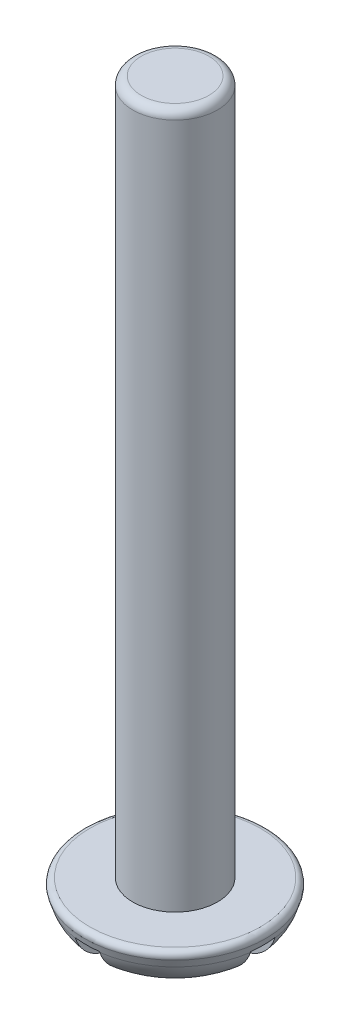
ISO-10303-21;
HEADER;
FILE_DESCRIPTION(('STEP AP214'),'2;1');
FILE_NAME('part.step','',(''),(''),'','','');
FILE_SCHEMA(('AUTOMOTIVE_DESIGN { 1 0 10303 214 1 1 1 1 }'));
ENDSEC;
DATA;
#1=APPLICATION_CONTEXT('core data for automotive mechanical design processes');
#2=APPLICATION_PROTOCOL_DEFINITION('international standard','automotive_design',2000,#1);
#3=PRODUCT_CONTEXT('',#1,'mechanical');
#4=PRODUCT('Part','Part','',(#3));
#5=PRODUCT_RELATED_PRODUCT_CATEGORY('part','',(#4));
#6=PRODUCT_DEFINITION_FORMATION('','',#4);
#7=PRODUCT_DEFINITION_CONTEXT('part definition',#1,'design');
#8=PRODUCT_DEFINITION('design','',#6,#7);
#9=PRODUCT_DEFINITION_SHAPE('','',#8);
#10=(LENGTH_UNIT() NAMED_UNIT(*) SI_UNIT(.MILLI.,.METRE.));
#11=(NAMED_UNIT(*) PLANE_ANGLE_UNIT() SI_UNIT($,.RADIAN.));
#12=(NAMED_UNIT(*) SI_UNIT($,.STERADIAN.) SOLID_ANGLE_UNIT());
#13=UNCERTAINTY_MEASURE_WITH_UNIT(LENGTH_MEASURE(1.E-05),#10,'distance_accuracy_value','');
#14=(GEOMETRIC_REPRESENTATION_CONTEXT(3) GLOBAL_UNCERTAINTY_ASSIGNED_CONTEXT((#13)) GLOBAL_UNIT_ASSIGNED_CONTEXT((#10,
#11,#12)) REPRESENTATION_CONTEXT('',''));
#15=CARTESIAN_POINT('',(0.,0.,0.));
#16=DIRECTION('',(0.,0.,1.));
#17=DIRECTION('',(1.,0.,0.));
#18=AXIS2_PLACEMENT_3D('',#15,#16,#17);
#19=CARTESIAN_POINT('',(-66.,-64.2440445445355,0.));
#20=DIRECTION('',(0.,1.,0.));
#21=DIRECTION('',(-1.,0.,0.));
#22=AXIS2_PLACEMENT_3D('',#19,#20,#21);
#23=PLANE('',#22);
#24=CARTESIAN_POINT('',(-76.,-64.24404454458,44.9));
#25=DIRECTION('',(0.,1.,0.));
#26=DIRECTION('',(0.,0.,1.));
#27=AXIS2_PLACEMENT_3D('',#24,#25,#26);
#28=CIRCLE('',#27,3.13754015185011);
#29=CARTESIAN_POINT('',(-79.1079709183227,-64.2440445445578,44.4702617361269));
#30=VERTEX_POINT('',#29);
#31=CARTESIAN_POINT('',(-79.1079709183227,-64.2440445445578,45.3297382638731));
#32=VERTEX_POINT('',#31);
#33=EDGE_CURVE('E523',#30,#32,#28,.T.);
#34=ORIENTED_EDGE('',*,*,#33,.F.);
#35=DIRECTION('',(1.,0.,0.));
#36=VECTOR('',#35,1.);
#37=CARTESIAN_POINT('',(-70.4602088971668,-64.2440445445355,44.4702617361269));
#38=LINE('',#37,#36);
#39=CARTESIAN_POINT('',(-76.429738263873,-64.2440445445355,44.4702617361269));
#40=VERTEX_POINT('',#39);
#41=EDGE_CURVE('E279',#30,#40,#38,.T.);
#42=ORIENTED_EDGE('',*,*,#41,.T.);
#43=DIRECTION('',(0.,0.,1.));
#44=VECTOR('',#43,1.);
#45=CARTESIAN_POINT('',(-76.429738263873,-64.2440445445355,50.0394058023663));
#46=LINE('',#45,#44);
#47=CARTESIAN_POINT('',(-76.429738263873,-64.2440445445578,41.7920290816773));
#48=VERTEX_POINT('',#47);
#49=EDGE_CURVE('E278',#48,#40,#46,.T.);
#50=ORIENTED_EDGE('',*,*,#49,.F.);
#51=CARTESIAN_POINT('',(-76.,-64.24404454458,44.9));
#52=DIRECTION('',(0.,1.,0.));
#53=DIRECTION('',(0.,0.,1.));
#54=AXIS2_PLACEMENT_3D('',#51,#52,#53);
#55=CIRCLE('',#54,3.13754015185011);
#56=CARTESIAN_POINT('',(-75.5702617361269,-64.2440445445578,41.7920290816773));
#57=VERTEX_POINT('',#56);
#58=EDGE_CURVE('E596',#57,#48,#55,.T.);
#59=ORIENTED_EDGE('',*,*,#58,.F.);
#60=DIRECTION('',(0.,0.,1.));
#61=VECTOR('',#60,1.);
#62=CARTESIAN_POINT('',(-75.5702617361269,-64.2440445445355,50.0394058023663));
#63=LINE('',#62,#61);
#64=CARTESIAN_POINT('',(-75.5702617361269,-64.2440445445355,44.4702617361269));
#65=VERTEX_POINT('',#64);
#66=EDGE_CURVE('E458',#57,#65,#63,.T.);
#67=ORIENTED_EDGE('',*,*,#66,.T.);
#68=DIRECTION('',(1.,0.,0.));
#69=VECTOR('',#68,1.);
#70=CARTESIAN_POINT('',(-70.4602088971668,-64.2440445445355,44.4702617361269));
#71=LINE('',#70,#69);
#72=CARTESIAN_POINT('',(-72.8920290816773,-64.2440445445578,44.4702617361269));
#73=VERTEX_POINT('',#72);
#74=EDGE_CURVE('E455',#65,#73,#71,.T.);
#75=ORIENTED_EDGE('',*,*,#74,.T.);
#76=CARTESIAN_POINT('',(-76.,-64.24404454458,44.9));
#77=DIRECTION('',(0.,1.,0.));
#78=DIRECTION('',(0.,0.,1.));
#79=AXIS2_PLACEMENT_3D('',#76,#77,#78);
#80=CIRCLE('',#79,3.13754015185011);
#81=CARTESIAN_POINT('',(-72.8920290816773,-64.2440445445578,45.3297382638731));
#82=VERTEX_POINT('',#81);
#83=EDGE_CURVE('E165',#82,#73,#80,.T.);
#84=ORIENTED_EDGE('',*,*,#83,.F.);
#85=DIRECTION('',(1.,0.,0.));
#86=VECTOR('',#85,1.);
#87=CARTESIAN_POINT('',(-70.4602088971668,-64.2440445445355,45.3297382638731));
#88=LINE('',#87,#86);
#89=CARTESIAN_POINT('',(-75.5702617361269,-64.2440445445355,45.3297382638731));
#90=VERTEX_POINT('',#89);
#91=EDGE_CURVE('E459',#90,#82,#88,.T.);
#92=ORIENTED_EDGE('',*,*,#91,.F.);
#93=DIRECTION('',(0.,0.,1.));
#94=VECTOR('',#93,1.);
#95=CARTESIAN_POINT('',(-75.5702617361269,-64.2440445445355,50.0394058023663));
#96=LINE('',#95,#94);
#97=CARTESIAN_POINT('',(-75.5702617361269,-64.2440445445578,48.0079709183227));
#98=VERTEX_POINT('',#97);
#99=EDGE_CURVE('E163',#90,#98,#96,.T.);
#100=ORIENTED_EDGE('',*,*,#99,.T.);
#101=CARTESIAN_POINT('',(-76.,-64.24404454458,44.9));
#102=DIRECTION('',(0.,1.,0.));
#103=DIRECTION('',(0.,0.,1.));
#104=AXIS2_PLACEMENT_3D('',#101,#102,#103);
#105=CIRCLE('',#104,3.13754015185011);
#106=CARTESIAN_POINT('',(-76.429738263873,-64.2440445445578,48.0079709183227));
#107=VERTEX_POINT('',#106);
#108=EDGE_CURVE('E146',#107,#98,#105,.T.);
#109=ORIENTED_EDGE('',*,*,#108,.F.);
#110=DIRECTION('',(0.,0.,1.));
#111=VECTOR('',#110,1.);
#112=CARTESIAN_POINT('',(-76.429738263873,-64.2440445445355,50.0394058023663));
#113=LINE('',#112,#111);
#114=CARTESIAN_POINT('',(-76.429738263873,-64.2440445445355,45.3297382638731));
#115=VERTEX_POINT('',#114);
#116=EDGE_CURVE('E160',#115,#107,#113,.T.);
#117=ORIENTED_EDGE('',*,*,#116,.F.);
#118=DIRECTION('',(1.,0.,0.));
#119=VECTOR('',#118,1.);
#120=CARTESIAN_POINT('',(-70.4602088971668,-64.2440445445355,45.3297382638731));
#121=LINE('',#120,#119);
#122=EDGE_CURVE('E182',#32,#115,#121,.T.);
#123=ORIENTED_EDGE('',*,*,#122,.F.);
#124=EDGE_LOOP('',(#34,#42,#50,#59,#67,#75,#84,#92,#100,#109,#117,#123));
#125=FACE_BOUND('',#124,.T.);
#126=ADVANCED_FACE('F17',(#125),#23,.F.);
#127=CARTESIAN_POINT('',(-70.4602088971668,-64.2440445445355,45.3297382638731));
#128=DIRECTION('',(0.,0.,-1.));
#129=DIRECTION('',(0.,1.,0.));
#130=AXIS2_PLACEMENT_3D('',#127,#128,#129);
#131=PLANE('',#130);
#132=DIRECTION('',(1.,0.,0.));
#133=VECTOR('',#132,1.);
#134=CARTESIAN_POINT('',(-76.,-65.2440445445355,45.3297382638731));
#135=LINE('',#134,#133);
#136=CARTESIAN_POINT('',(-77.7432741973312,-65.2440445445355,45.3297382638731));
#137=VERTEX_POINT('',#136);
#138=CARTESIAN_POINT('',(-76.429738263873,-65.2440445445355,45.3297382638731));
#139=VERTEX_POINT('',#138);
#140=EDGE_CURVE('E155',#137,#139,#135,.T.);
#141=ORIENTED_EDGE('',*,*,#140,.F.);
#142=CARTESIAN_POINT('',(-79.0972696094599,-64.2766683366526,45.3297382638731));
#143=CARTESIAN_POINT('',(-79.0850298094965,-64.3139806844564,45.3297382638731));
#144=CARTESIAN_POINT('',(-79.0712134523049,-64.3507557521747,45.3297382638731));
#145=CARTESIAN_POINT('',(-79.0405243690052,-64.4230043509682,45.3297382638731));
#146=CARTESIAN_POINT('',(-79.023651878397,-64.4584779820767,45.3297382638731));
#147=CARTESIAN_POINT('',(-78.9686557067881,-64.5624945272485,45.3297382638731));
#148=CARTESIAN_POINT('',(-78.9261102283197,-64.628763942647,45.3297382638731));
#149=CARTESIAN_POINT('',(-78.8305219251969,-64.7532117619126,45.3297382638731));
#150=CARTESIAN_POINT('',(-78.7774762648678,-64.8113879728897,45.3297382638731));
#151=CARTESIAN_POINT('',(-78.6624295741607,-64.918066795754,45.3297382638731));
#152=CARTESIAN_POINT('',(-78.6004305348628,-64.9665715527145,45.3297382638731));
#153=CARTESIAN_POINT('',(-78.468862361044,-65.0528868607357,45.3297382638731));
#154=CARTESIAN_POINT('',(-78.3992497355834,-65.0906310006582,45.3297382638731));
#155=CARTESIAN_POINT('',(-78.2547201530278,-65.1541000828846,45.3297382638731));
#156=CARTESIAN_POINT('',(-78.1798022873695,-65.1798229606943,45.3297382638731));
#157=CARTESIAN_POINT('',(-78.0444982032147,-65.2141903018014,45.3297382638731));
#158=CARTESIAN_POINT('',(-77.9847487392921,-65.2254062108368,45.3297382638731));
#159=CARTESIAN_POINT('',(-77.8644260652135,-65.2403368668095,45.3297382638731));
#160=CARTESIAN_POINT('',(-77.8038545059072,-65.2440648962274,45.3297382638731));
#161=CARTESIAN_POINT('',(-77.7432741973312,-65.2440445445355,45.3297382638731));
#162=B_SPLINE_CURVE_WITH_KNOTS('',3,(#142,#143,#144,#145,#146,#147,#148,#149,#150,#151,#152,
#153,#154,#155,#156,#157,#158,#159,#160,#161),.UNSPECIFIED.,.F.,.F.,(4,2,2,2,2,2,2,2,2,4),(0.,
0.117732729425159,0.23545639044209,0.470495711789309,0.705598594569883,0.940649274725469,
1.17712067374321,1.413632668713,1.59555904090016,1.77716241441052),.UNSPECIFIED.);
#163=CARTESIAN_POINT('',(-79.0972696094643,-64.276668336639,45.3297382638731));
#164=VERTEX_POINT('',#163);
#165=EDGE_CURVE('E271',#164,#137,#162,.T.);
#166=ORIENTED_EDGE('',*,*,#165,.F.);
#167=DIRECTION('',(-0.31168172744965,0.950186561036306,0.));
#168=VECTOR('',#167,1.);
#169=CARTESIAN_POINT('',(-79.0972696094573,-64.2766683366605,45.3297382638731));
#170=LINE('',#169,#168);
#171=EDGE_CURVE('E184',#164,#32,#170,.T.);
#172=ORIENTED_EDGE('',*,*,#171,.T.);
#173=ORIENTED_EDGE('',*,*,#122,.T.);
#174=DIRECTION('',(0.,1.,0.));
#175=VECTOR('',#174,1.);
#176=CARTESIAN_POINT('',(-76.429738263873,-64.2440445445355,45.3297382638731));
#177=LINE('',#176,#175);
#178=EDGE_CURVE('E170',#139,#115,#177,.T.);
#179=ORIENTED_EDGE('',*,*,#178,.F.);
#180=EDGE_LOOP('',(#141,#166,#172,#173,#179));
#181=FACE_BOUND('',#180,.T.);
#182=ADVANCED_FACE('F525',(#181),#131,.T.);
#183=CARTESIAN_POINT('',(-76.,-65.2440445445355,44.9));
#184=DIRECTION('',(0.,-1.,0.));
#185=DIRECTION('',(1.,0.,0.));
#186=AXIS2_PLACEMENT_3D('',#183,#184,#185);
#187=PLANE('',#186);
#188=ORIENTED_EDGE('',*,*,#140,.T.);
#189=DIRECTION('',(0.,0.,1.));
#190=VECTOR('',#189,1.);
#191=CARTESIAN_POINT('',(-76.429738263873,-65.2440445445355,50.0394058023663));
#192=LINE('',#191,#190);
#193=CARTESIAN_POINT('',(-76.4297382638727,-65.2440445445355,46.6432741973366));
#194=VERTEX_POINT('',#193);
#195=EDGE_CURVE('E154',#194,#139,#192,.F.);
#196=ORIENTED_EDGE('',*,*,#195,.F.);
#197=CARTESIAN_POINT('',(-76.,-65.2440445445355,44.9));
#198=DIRECTION('',(0.,1.,0.));
#199=DIRECTION('',(-0.970934082359855,0.,0.239347044502386));
#200=AXIS2_PLACEMENT_3D('',#197,#198,#199);
#201=CIRCLE('',#200,1.79546091645502);
#202=EDGE_CURVE('E510',#137,#194,#201,.T.);
#203=ORIENTED_EDGE('',*,*,#202,.F.);
#204=EDGE_LOOP('',(#188,#196,#203));
#205=FACE_BOUND('',#204,.T.);
#206=ADVANCED_FACE('F528',(#205),#187,.T.);
#207=CARTESIAN_POINT('',(-76.429738263873,-64.2440445445355,50.0394058023663));
#208=DIRECTION('',(1.,0.,0.));
#209=DIRECTION('',(0.,1.,0.));
#210=AXIS2_PLACEMENT_3D('',#207,#208,#209);
#211=PLANE('',#210);
#212=ORIENTED_EDGE('',*,*,#178,.T.);
#213=ORIENTED_EDGE('',*,*,#116,.T.);
#214=DIRECTION('',(0.,-0.950186561036246,-0.311681727449833));
#215=VECTOR('',#214,1.);
#216=CARTESIAN_POINT('',(-76.429738263873,-64.2440445445355,48.0079709183396));
#217=LINE('',#216,#215);
#218=CARTESIAN_POINT('',(-76.429738263873,-64.276668336639,47.9972696094643));
#219=VERTEX_POINT('',#218);
#220=EDGE_CURVE('E141',#107,#219,#217,.T.);
#221=ORIENTED_EDGE('',*,*,#220,.T.);
#222=CARTESIAN_POINT('',(-76.429738263873,-65.2440445445355,46.6432741973366));
#223=CARTESIAN_POINT('',(-76.429738263873,-65.2440517508389,46.6881301465073));
#224=CARTESIAN_POINT('',(-76.429738263873,-65.2420122114742,46.7329882302298));
#225=CARTESIAN_POINT('',(-76.429738263873,-65.2338386033226,46.8223397292429));
#226=CARTESIAN_POINT('',(-76.429738263873,-65.2277035882184,46.8668330578458));
#227=CARTESIAN_POINT('',(-76.429738263873,-65.2113435508749,46.9550350246902));
#228=CARTESIAN_POINT('',(-76.429738263873,-65.2011213125297,46.9987441759214));
#229=CARTESIAN_POINT('',(-76.429738263873,-65.176654474412,47.0850007763103));
#230=CARTESIAN_POINT('',(-76.429738263873,-65.1624106079998,47.1275484357209));
#231=CARTESIAN_POINT('',(-76.429738263873,-65.1165797597767,47.2456445128947));
#232=CARTESIAN_POINT('',(-76.429738263873,-65.0803787677518,47.3194636126137));
#233=CARTESIAN_POINT('',(-76.429738263873,-64.9958084458353,47.4596669136017));
#234=CARTESIAN_POINT('',(-76.429738263873,-64.9474469285762,47.5260558490198));
#235=CARTESIAN_POINT('',(-76.429738263873,-64.8413198326977,47.6478278381564));
#236=CARTESIAN_POINT('',(-76.429738263873,-64.7838296435142,47.7034510174641));
#237=CARTESIAN_POINT('',(-76.429738263873,-64.6602174906193,47.8040866049658));
#238=CARTESIAN_POINT('',(-76.429738263873,-64.594100374295,47.8491049323678));
#239=CARTESIAN_POINT('',(-76.429738263873,-64.4852083664648,47.9103176350549));
#240=CARTESIAN_POINT('',(-76.4297382638731,-64.4446618838941,47.9305704285894));
#241=CARTESIAN_POINT('',(-76.429738263873,-64.3618677526702,47.966998434105));
#242=CARTESIAN_POINT('',(-76.429738263873,-64.3196234370481,47.9831812220745));
#243=CARTESIAN_POINT('',(-76.4297382638729,-64.2766683366528,47.9972696094598));
#244=B_SPLINE_CURVE_WITH_KNOTS('',3,(#222,#223,#224,#225,#226,#227,#228,#229,#230,#231,#232,
#233,#234,#235,#236,#237,#238,#239,#240,#241,#242,#243),.UNSPECIFIED.,.F.,.F.,(4,2,2,2,2,2,2,2,
2,2,4),(0.,0.134523842047416,0.269078778490919,0.403542222429493,0.537981162231119,
0.78331756487569,1.02849674999703,1.26733850226045,1.50604662496479,1.64182243436018,
1.77734360560696),.UNSPECIFIED.);
#245=EDGE_CURVE('E508',#194,#219,#244,.T.);
#246=ORIENTED_EDGE('',*,*,#245,.F.);
#247=ORIENTED_EDGE('',*,*,#195,.T.);
#248=EDGE_LOOP('',(#212,#213,#221,#246,#247));
#249=FACE_BOUND('',#248,.T.);
#250=ADVANCED_FACE('F167',(#249),#211,.T.);
#251=CARTESIAN_POINT('',(-75.5702617361269,-64.2440445445355,50.0394058023663));
#252=DIRECTION('',(1.,0.,0.));
#253=DIRECTION('',(0.,1.,0.));
#254=AXIS2_PLACEMENT_3D('',#251,#252,#253);
#255=PLANE('',#254);
#256=DIRECTION('',(0.,-0.950186561036246,-0.311681727449833));
#257=VECTOR('',#256,1.);
#258=CARTESIAN_POINT('',(-75.5702617361269,-64.2440445445355,48.0079709183396));
#259=LINE('',#258,#257);
#260=CARTESIAN_POINT('',(-75.5702617361269,-64.276668336639,47.9972696094643));
#261=VERTEX_POINT('',#260);
#262=EDGE_CURVE('E172',#98,#261,#259,.T.);
#263=ORIENTED_EDGE('',*,*,#262,.F.);
#264=ORIENTED_EDGE('',*,*,#99,.F.);
#265=DIRECTION('',(0.,1.,0.));
#266=VECTOR('',#265,1.);
#267=CARTESIAN_POINT('',(-75.5702617361269,-64.2440445445355,45.3297382638731));
#268=LINE('',#267,#266);
#269=CARTESIAN_POINT('',(-75.5702617361269,-65.2440445445355,45.3297382638731));
#270=VERTEX_POINT('',#269);
#271=EDGE_CURVE('E463',#270,#90,#268,.T.);
#272=ORIENTED_EDGE('',*,*,#271,.F.);
#273=DIRECTION('',(0.,0.,1.));
#274=VECTOR('',#273,1.);
#275=CARTESIAN_POINT('',(-75.5702617361269,-65.2440445445355,44.9));
#276=LINE('',#275,#274);
#277=CARTESIAN_POINT('',(-75.5702617361269,-65.2440445445355,46.6432741973379));
#278=VERTEX_POINT('',#277);
#279=EDGE_CURVE('E468',#278,#270,#276,.F.);
#280=ORIENTED_EDGE('',*,*,#279,.F.);
#281=CARTESIAN_POINT('',(-75.5702617361269,-64.2766683366526,47.9972696094599));
#282=CARTESIAN_POINT('',(-75.5702617361269,-64.3139806844564,47.9850298094965));
#283=CARTESIAN_POINT('',(-75.5702617361269,-64.3507557521747,47.9712134523049));
#284=CARTESIAN_POINT('',(-75.5702617361269,-64.4230043509682,47.9405243690052));
#285=CARTESIAN_POINT('',(-75.5702617361269,-64.4584779820767,47.923651878397));
#286=CARTESIAN_POINT('',(-75.5702617361269,-64.5624945272485,47.8686557067882));
#287=CARTESIAN_POINT('',(-75.5702617361269,-64.628763942647,47.8261102283198));
#288=CARTESIAN_POINT('',(-75.5702617361269,-64.7532117619126,47.730521925197));
#289=CARTESIAN_POINT('',(-75.5702617361269,-64.8113879728897,47.6774762648678));
#290=CARTESIAN_POINT('',(-75.5702617361269,-64.918066795754,47.5624295741607));
#291=CARTESIAN_POINT('',(-75.5702617361269,-64.9665715527145,47.5004305348628));
#292=CARTESIAN_POINT('',(-75.5702617361269,-65.0528868607357,47.3688623610441));
#293=CARTESIAN_POINT('',(-75.5702617361269,-65.0906310006582,47.2992497355834));
#294=CARTESIAN_POINT('',(-75.5702617361269,-65.1541000828846,47.1547201530278));
#295=CARTESIAN_POINT('',(-75.5702617361269,-65.1798229606943,47.0798022873696));
#296=CARTESIAN_POINT('',(-75.5702617361269,-65.2141903018011,46.9444982032158));
#297=CARTESIAN_POINT('',(-75.5702617361269,-65.2254062108364,46.8847487392943));
#298=CARTESIAN_POINT('',(-75.5702617361269,-65.2403368668091,46.764426065218));
#299=CARTESIAN_POINT('',(-75.5702617361269,-65.2440648962271,46.7038545059128));
#300=CARTESIAN_POINT('',(-75.5702617361269,-65.2440445445355,46.6432741973379));
#301=B_SPLINE_CURVE_WITH_KNOTS('',3,(#281,#282,#283,#284,#285,#286,#287,#288,#289,#290,#291,
#292,#293,#294,#295,#296,#297,#298,#299,#300),.UNSPECIFIED.,.F.,.F.,(4,2,2,2,2,2,2,2,2,4),(0.,
0.117732729425167,0.2354563904421,0.470495711789308,0.705598594569882,0.940649274725468,
1.17712067374319,1.413632668713,1.59555904089684,1.7771624144039),.UNSPECIFIED.);
#302=EDGE_CURVE('E506',#261,#278,#301,.T.);
#303=ORIENTED_EDGE('',*,*,#302,.F.);
#304=EDGE_LOOP('',(#263,#264,#272,#280,#303));
#305=FACE_BOUND('',#304,.T.);
#306=ADVANCED_FACE('F491',(#305),#255,.F.);
#307=CARTESIAN_POINT('',(-76.,-65.2440445445355,44.9));
#308=DIRECTION('',(0.,-1.,0.));
#309=DIRECTION('',(1.,0.,0.));
#310=AXIS2_PLACEMENT_3D('',#307,#308,#309);
#311=PLANE('',#310);
#312=DIRECTION('',(1.,0.,0.));
#313=VECTOR('',#312,1.);
#314=CARTESIAN_POINT('',(-70.4602088971668,-65.2440445445355,45.3297382638731));
#315=LINE('',#314,#313);
#316=CARTESIAN_POINT('',(-74.2567258026621,-65.2440445445355,45.3297382638731));
#317=VERTEX_POINT('',#316);
#318=EDGE_CURVE('E460',#317,#270,#315,.F.);
#319=ORIENTED_EDGE('',*,*,#318,.F.);
#320=CARTESIAN_POINT('',(-76.,-65.2440445445355,44.9));
#321=DIRECTION('',(0.,1.,0.));
#322=DIRECTION('',(0.239347044501533,0.,0.970934082360065));
#323=AXIS2_PLACEMENT_3D('',#320,#321,#322);
#324=CIRCLE('',#323,1.79546091646145);
#325=EDGE_CURVE('E473',#278,#317,#324,.T.);
#326=ORIENTED_EDGE('',*,*,#325,.F.);
#327=ORIENTED_EDGE('',*,*,#279,.T.);
#328=EDGE_LOOP('',(#319,#326,#327));
#329=FACE_BOUND('',#328,.T.);
#330=ADVANCED_FACE('F480',(#329),#311,.T.);
#331=CARTESIAN_POINT('',(-70.4602088971668,-64.2440445445355,45.3297382638731));
#332=DIRECTION('',(0.,0.,-1.));
#333=DIRECTION('',(0.,1.,0.));
#334=AXIS2_PLACEMENT_3D('',#331,#332,#333);
#335=PLANE('',#334);
#336=ORIENTED_EDGE('',*,*,#271,.T.);
#337=ORIENTED_EDGE('',*,*,#91,.T.);
#338=DIRECTION('',(-0.311681727450015,-0.950186561036186,0.));
#339=VECTOR('',#338,1.);
#340=CARTESIAN_POINT('',(-72.8920290816604,-64.2440445445355,45.3297382638731));
#341=LINE('',#340,#339);
#342=CARTESIAN_POINT('',(-72.9027303905357,-64.276668336639,45.3297382638731));
#343=VERTEX_POINT('',#342);
#344=EDGE_CURVE('E464',#82,#343,#341,.T.);
#345=ORIENTED_EDGE('',*,*,#344,.T.);
#346=CARTESIAN_POINT('',(-74.2567258026621,-65.2440445445355,45.3297382638731));
#347=CARTESIAN_POINT('',(-74.2118698534914,-65.2440517508389,45.3297382638731));
#348=CARTESIAN_POINT('',(-74.1670117697688,-65.2420122114741,45.3297382638731));
#349=CARTESIAN_POINT('',(-74.0776602707558,-65.2338386033225,45.3297382638731));
#350=CARTESIAN_POINT('',(-74.0331669421528,-65.2277035882182,45.3297382638731));
#351=CARTESIAN_POINT('',(-73.9449649753083,-65.2113435508746,45.3297382638731));
#352=CARTESIAN_POINT('',(-73.9012558240771,-65.2011213125293,45.3297382638731));
#353=CARTESIAN_POINT('',(-73.8149992236882,-65.1766544744115,45.3297382638731));
#354=CARTESIAN_POINT('',(-73.7724515642776,-65.1624106079993,45.3297382638731));
#355=CARTESIAN_POINT('',(-73.6543554871038,-65.116579759776,45.3297382638731));
#356=CARTESIAN_POINT('',(-73.5805363873848,-65.080378767751,45.3297382638731));
#357=CARTESIAN_POINT('',(-73.440333086397,-64.9958084458344,45.3297382638731));
#358=CARTESIAN_POINT('',(-73.3739441509789,-64.9474469285752,45.3297382638731));
#359=CARTESIAN_POINT('',(-73.2521721618425,-64.8413198326966,45.3297382638731));
#360=CARTESIAN_POINT('',(-73.1965489825348,-64.783829643513,45.3297382638731));
#361=CARTESIAN_POINT('',(-73.0959133950333,-64.660217490618,45.3297382638731));
#362=CARTESIAN_POINT('',(-73.0508950676313,-64.5941003742937,45.3297382638731));
#363=CARTESIAN_POINT('',(-72.9896823649445,-64.4852083664637,45.3297382638731));
#364=CARTESIAN_POINT('',(-72.9694295714101,-64.4446618838932,45.3297382638731));
#365=CARTESIAN_POINT('',(-72.9330015658948,-64.3618677526697,45.329738263873));
#366=CARTESIAN_POINT('',(-72.9168187779254,-64.3196234370479,45.329738263873));
#367=CARTESIAN_POINT('',(-72.9027303905401,-64.2766683366528,45.3297382638729));
#368=B_SPLINE_CURVE_WITH_KNOTS('',3,(#346,#347,#348,#349,#350,#351,#352,#353,#354,#355,#356,
#357,#358,#359,#360,#361,#362,#363,#364,#365,#366,#367),.UNSPECIFIED.,.F.,.F.,(4,2,2,2,2,2,2,2,
2,2,4),(0.,0.134523842047512,0.26907877849111,0.403542222429795,0.53798116223152,
0.783317564876059,1.02849674999737,1.26733850226078,1.50604662496511,1.64182243435971,
1.77734360560571),.UNSPECIFIED.);
#369=EDGE_CURVE('E600',#317,#343,#368,.T.);
#370=ORIENTED_EDGE('',*,*,#369,.F.);
#371=ORIENTED_EDGE('',*,*,#318,.T.);
#372=EDGE_LOOP('',(#336,#337,#345,#370,#371));
#373=FACE_BOUND('',#372,.T.);
#374=ADVANCED_FACE('F490',(#373),#335,.T.);
#375=CARTESIAN_POINT('',(-75.5702617361269,-64.2440445445355,50.0394058023663));
#376=DIRECTION('',(1.,0.,0.));
#377=DIRECTION('',(0.,1.,0.));
#378=AXIS2_PLACEMENT_3D('',#375,#376,#377);
#379=PLANE('',#378);
#380=DIRECTION('',(0.,0.950186561036246,-0.311681727449833));
#381=VECTOR('',#380,1.);
#382=CARTESIAN_POINT('',(-75.5702617361269,-64.2766683366605,41.8027303905427));
#383=LINE('',#382,#381);
#384=CARTESIAN_POINT('',(-75.5702617361269,-64.276668336639,41.8027303905357));
#385=VERTEX_POINT('',#384);
#386=EDGE_CURVE('E456',#385,#57,#383,.T.);
#387=ORIENTED_EDGE('',*,*,#386,.F.);
#388=CARTESIAN_POINT('',(-75.5702617361269,-65.2440445445355,43.1567258026775));
#389=CARTESIAN_POINT('',(-75.5702617361269,-65.2440517508393,43.1118698535071));
#390=CARTESIAN_POINT('',(-75.5702617361269,-65.242012211475,43.067011769785));
#391=CARTESIAN_POINT('',(-75.5702617361269,-65.2338386033245,42.9776602707726));
#392=CARTESIAN_POINT('',(-75.5702617361269,-65.2277035882208,42.93316694217));
#393=CARTESIAN_POINT('',(-75.5702617361269,-65.2113435508785,42.8449649753261));
#394=CARTESIAN_POINT('',(-75.5702617361269,-65.2011213125338,42.8012558240952));
#395=CARTESIAN_POINT('',(-75.5702617361269,-65.1766544744174,42.7149992237067));
#396=CARTESIAN_POINT('',(-75.5702617361269,-65.1624106080059,42.6724515642963));
#397=CARTESIAN_POINT('',(-75.5702617361269,-65.1165797597844,42.5543554871221));
#398=CARTESIAN_POINT('',(-75.5702617361269,-65.0803787677604,42.4805363874026));
#399=CARTESIAN_POINT('',(-75.5702617361269,-64.9958084458456,42.3403330864134));
#400=CARTESIAN_POINT('',(-75.5702617361269,-64.9474469285873,42.2739441509945));
#401=CARTESIAN_POINT('',(-75.5702617361269,-64.8413198327102,42.1521721618565));
#402=CARTESIAN_POINT('',(-75.5702617361269,-64.7838296435274,42.096548982548));
#403=CARTESIAN_POINT('',(-75.5702617361269,-64.6602174906337,41.9959133950447));
#404=CARTESIAN_POINT('',(-75.5702617361269,-64.59410037431,41.9508950676417));
#405=CARTESIAN_POINT('',(-75.5702617361269,-64.4852083664779,41.8896823649519));
#406=CARTESIAN_POINT('',(-75.5702617361269,-64.4446618839048,41.8694295714156));
#407=CARTESIAN_POINT('',(-75.570261736127,-64.3618677526757,41.8330015658971));
#408=CARTESIAN_POINT('',(-75.570261736127,-64.3196234370509,41.8168187779265));
#409=CARTESIAN_POINT('',(-75.5702617361272,-64.2766683366528,41.8027303905402));
#410=B_SPLINE_CURVE_WITH_KNOTS('',3,(#388,#389,#390,#391,#392,#393,#394,#395,#396,#397,#398,
#399,#400,#401,#402,#403,#404,#405,#406,#407,#408,#409),.UNSPECIFIED.,.F.,.F.,(4,2,2,2,2,2,2,2,
2,2,4),(0.,0.134523842046293,0.26907877848867,0.403542222426139,0.537981162226646,
0.783317564871489,1.02849674999312,1.26733850225668,1.5060466249612,1.6418224343654,
1.77734360562101),.UNSPECIFIED.);
#411=CARTESIAN_POINT('',(-75.570261736126,-65.2440445445355,43.1567258026774));
#412=VERTEX_POINT('',#411);
#413=EDGE_CURVE('E234',#412,#385,#410,.T.);
#414=ORIENTED_EDGE('',*,*,#413,.F.);
#415=DIRECTION('',(0.,0.,1.));
#416=VECTOR('',#415,1.);
#417=CARTESIAN_POINT('',(-75.5702617361269,-65.2440445445355,44.9));
#418=LINE('',#417,#416);
#419=CARTESIAN_POINT('',(-75.5702617361269,-65.2440445445355,44.4702617361269));
#420=VERTEX_POINT('',#419);
#421=EDGE_CURVE('E454',#420,#412,#418,.F.);
#422=ORIENTED_EDGE('',*,*,#421,.F.);
#423=DIRECTION('',(0.,1.,0.));
#424=VECTOR('',#423,1.);
#425=CARTESIAN_POINT('',(-75.5702617361269,-64.2440445445355,44.4702617361269));
#426=LINE('',#425,#424);
#427=EDGE_CURVE('E571',#420,#65,#426,.T.);
#428=ORIENTED_EDGE('',*,*,#427,.T.);
#429=ORIENTED_EDGE('',*,*,#66,.F.);
#430=EDGE_LOOP('',(#387,#414,#422,#428,#429));
#431=FACE_BOUND('',#430,.T.);
#432=ADVANCED_FACE('F335',(#431),#379,.F.);
#433=CARTESIAN_POINT('',(-70.4602088971668,-64.2440445445355,44.4702617361269));
#434=DIRECTION('',(0.,0.,-1.));
#435=DIRECTION('',(0.,1.,0.));
#436=AXIS2_PLACEMENT_3D('',#433,#434,#435);
#437=PLANE('',#436);
#438=DIRECTION('',(-0.311681727450015,-0.950186561036186,0.));
#439=VECTOR('',#438,1.);
#440=CARTESIAN_POINT('',(-72.8920290816604,-64.2440445445355,44.4702617361269));
#441=LINE('',#440,#439);
#442=CARTESIAN_POINT('',(-72.9027303905357,-64.276668336639,44.4702617361269));
#443=VERTEX_POINT('',#442);
#444=EDGE_CURVE('E447',#73,#443,#441,.T.);
#445=ORIENTED_EDGE('',*,*,#444,.F.);
#446=ORIENTED_EDGE('',*,*,#74,.F.);
#447=ORIENTED_EDGE('',*,*,#427,.F.);
#448=DIRECTION('',(1.,0.,0.));
#449=VECTOR('',#448,1.);
#450=CARTESIAN_POINT('',(-76.,-65.2440445445355,44.4702617361269));
#451=LINE('',#450,#449);
#452=CARTESIAN_POINT('',(-74.2567258026621,-65.2440445445355,44.4702617361269));
#453=VERTEX_POINT('',#452);
#454=EDGE_CURVE('E285',#453,#420,#451,.F.);
#455=ORIENTED_EDGE('',*,*,#454,.F.);
#456=CARTESIAN_POINT('',(-72.9027303905401,-64.2766683366526,44.4702617361269));
#457=CARTESIAN_POINT('',(-72.9149701905035,-64.3139806844564,44.4702617361269));
#458=CARTESIAN_POINT('',(-72.9287865476951,-64.3507557521747,44.4702617361269));
#459=CARTESIAN_POINT('',(-72.9594756309948,-64.4230043509682,44.4702617361269));
#460=CARTESIAN_POINT('',(-72.976348121603,-64.4584779820767,44.4702617361269));
#461=CARTESIAN_POINT('',(-73.0313442932118,-64.5624945272485,44.4702617361269));
#462=CARTESIAN_POINT('',(-73.0738897716802,-64.628763942647,44.4702617361269));
#463=CARTESIAN_POINT('',(-73.169478074803,-64.7532117619126,44.4702617361269));
#464=CARTESIAN_POINT('',(-73.2225237351321,-64.8113879728897,44.4702617361269));
#465=CARTESIAN_POINT('',(-73.3375704258393,-64.918066795754,44.4702617361269));
#466=CARTESIAN_POINT('',(-73.3995694651372,-64.9665715527145,44.4702617361269));
#467=CARTESIAN_POINT('',(-73.5311376389559,-65.0528868607357,44.4702617361269));
#468=CARTESIAN_POINT('',(-73.6007502644166,-65.0906310006582,44.4702617361269));
#469=CARTESIAN_POINT('',(-73.7452798469722,-65.1541000828846,44.4702617361269));
#470=CARTESIAN_POINT('',(-73.8201977126304,-65.1798229606943,44.4702617361269));
#471=CARTESIAN_POINT('',(-73.9555017967842,-65.2141903018011,44.4702617361269));
#472=CARTESIAN_POINT('',(-74.0152512607057,-65.2254062108364,44.4702617361269));
#473=CARTESIAN_POINT('',(-74.135573934782,-65.2403368668091,44.4702617361269));
#474=CARTESIAN_POINT('',(-74.1961454940872,-65.2440648962271,44.4702617361269));
#475=CARTESIAN_POINT('',(-74.2567258026621,-65.2440445445355,44.4702617361269));
#476=B_SPLINE_CURVE_WITH_KNOTS('',3,(#456,#457,#458,#459,#460,#461,#462,#463,#464,#465,#466,
#467,#468,#469,#470,#471,#472,#473,#474,#475),.UNSPECIFIED.,.F.,.F.,(4,2,2,2,2,2,2,2,2,4),(0.,
0.117732729425159,0.23545639044209,0.470495711789309,0.705598594569874,0.940649274725459,
1.17712067374318,1.41363266871299,1.59555904089682,1.77716241440387),.UNSPECIFIED.);
#477=EDGE_CURVE('E230',#443,#453,#476,.T.);
#478=ORIENTED_EDGE('',*,*,#477,.F.);
#479=EDGE_LOOP('',(#445,#446,#447,#455,#478));
#480=FACE_BOUND('',#479,.T.);
#481=ADVANCED_FACE('F242',(#480),#437,.F.);
#482=CARTESIAN_POINT('',(-76.,-65.2440445445355,44.9));
#483=DIRECTION('',(0.,-1.,0.));
#484=DIRECTION('',(1.,0.,0.));
#485=AXIS2_PLACEMENT_3D('',#482,#483,#484);
#486=PLANE('',#485);
#487=CARTESIAN_POINT('',(-76.,-65.2440445445355,44.9));
#488=DIRECTION('',(0.,1.,0.));
#489=DIRECTION('',(0.970934082360064,0.,-0.239347044501535));
#490=AXIS2_PLACEMENT_3D('',#487,#488,#489);
#491=CIRCLE('',#490,1.79546091646146);
#492=EDGE_CURVE('E233',#453,#412,#491,.T.);
#493=ORIENTED_EDGE('',*,*,#492,.F.);
#494=ORIENTED_EDGE('',*,*,#454,.T.);
#495=ORIENTED_EDGE('',*,*,#421,.T.);
#496=EDGE_LOOP('',(#493,#494,#495));
#497=FACE_BOUND('',#496,.T.);
#498=ADVANCED_FACE('F322',(#497),#486,.T.);
#499=CARTESIAN_POINT('',(-76.,-65.2440445445355,44.9));
#500=DIRECTION('',(0.,-1.,0.));
#501=DIRECTION('',(1.,0.,0.));
#502=AXIS2_PLACEMENT_3D('',#499,#500,#501);
#503=PLANE('',#502);
#504=CARTESIAN_POINT('',(-76.,-65.2440445445355,44.9));
#505=DIRECTION('',(0.,1.,0.));
#506=DIRECTION('',(-0.239347044503973,0.,-0.970934082359463));
#507=AXIS2_PLACEMENT_3D('',#504,#505,#506);
#508=CIRCLE('',#507,1.79546091644314);
#509=CARTESIAN_POINT('',(-76.429738263873,-65.2440445445355,43.156725802681));
#510=VERTEX_POINT('',#509);
#511=CARTESIAN_POINT('',(-77.743274197319,-65.2440445445355,44.4702617361269));
#512=VERTEX_POINT('',#511);
#513=EDGE_CURVE('E292',#510,#512,#508,.T.);
#514=ORIENTED_EDGE('',*,*,#513,.F.);
#515=DIRECTION('',(0.,0.,1.));
#516=VECTOR('',#515,1.);
#517=CARTESIAN_POINT('',(-76.429738263873,-65.2440445445355,50.0394058023663));
#518=LINE('',#517,#516);
#519=CARTESIAN_POINT('',(-76.429738263873,-65.2440445445355,44.4702617361269));
#520=VERTEX_POINT('',#519);
#521=EDGE_CURVE('E268',#520,#510,#518,.F.);
#522=ORIENTED_EDGE('',*,*,#521,.F.);
#523=DIRECTION('',(1.,0.,0.));
#524=VECTOR('',#523,1.);
#525=CARTESIAN_POINT('',(-70.4602088971668,-65.2440445445355,44.4702617361269));
#526=LINE('',#525,#524);
#527=EDGE_CURVE('E283',#520,#512,#526,.F.);
#528=ORIENTED_EDGE('',*,*,#527,.T.);
#529=EDGE_LOOP('',(#514,#522,#528));
#530=FACE_BOUND('',#529,.T.);
#531=ADVANCED_FACE('F221',(#530),#503,.T.);
#532=CARTESIAN_POINT('',(-70.4602088971668,-64.2440445445355,44.4702617361269));
#533=DIRECTION('',(0.,0.,-1.));
#534=DIRECTION('',(0.,1.,0.));
#535=AXIS2_PLACEMENT_3D('',#532,#533,#534);
#536=PLANE('',#535);
#537=DIRECTION('',(-0.31168172744965,0.950186561036306,0.));
#538=VECTOR('',#537,1.);
#539=CARTESIAN_POINT('',(-79.0972696094573,-64.2766683366605,44.4702617361269));
#540=LINE('',#539,#538);
#541=CARTESIAN_POINT('',(-79.0972696094643,-64.276668336639,44.4702617361269));
#542=VERTEX_POINT('',#541);
#543=EDGE_CURVE('E280',#542,#30,#540,.T.);
#544=ORIENTED_EDGE('',*,*,#543,.F.);
#545=CARTESIAN_POINT('',(-77.743274197319,-65.2440445445355,44.4702617361269));
#546=CARTESIAN_POINT('',(-77.7881301464892,-65.2440517508394,44.4702617361269));
#547=CARTESIAN_POINT('',(-77.8329882302113,-65.2420122114753,44.4702617361269));
#548=CARTESIAN_POINT('',(-77.9223397292235,-65.233838603325,44.4702617361269));
#549=CARTESIAN_POINT('',(-77.966833057826,-65.2277035882214,44.4702617361269));
#550=CARTESIAN_POINT('',(-78.0550350246697,-65.2113435508794,44.4702617361269));
#551=CARTESIAN_POINT('',(-78.0987441759006,-65.2011213125349,44.4702617361269));
#552=CARTESIAN_POINT('',(-78.185000776289,-65.1766544744187,44.4702617361269));
#553=CARTESIAN_POINT('',(-78.2275484356994,-65.1624106080074,44.4702617361269));
#554=CARTESIAN_POINT('',(-78.3456445128736,-65.1165797597863,44.4702617361269));
#555=CARTESIAN_POINT('',(-78.4194636125933,-65.0803787677625,44.4702617361269));
#556=CARTESIAN_POINT('',(-78.5596669135828,-64.9958084458482,44.4702617361269));
#557=CARTESIAN_POINT('',(-78.6260558490019,-64.9474469285901,44.4702617361269));
#558=CARTESIAN_POINT('',(-78.7478278381402,-64.8413198327134,44.4702617361269));
#559=CARTESIAN_POINT('',(-78.8034510174489,-64.7838296435308,44.4702617361269));
#560=CARTESIAN_POINT('',(-78.9040866049527,-64.6602174906374,44.470261736127));
#561=CARTESIAN_POINT('',(-78.9491049323558,-64.5941003743138,44.470261736127));
#562=CARTESIAN_POINT('',(-79.0103176350464,-64.4852083664812,44.4702617361269));
#563=CARTESIAN_POINT('',(-79.0305704285831,-64.4446618839075,44.4702617361269));
#564=CARTESIAN_POINT('',(-79.0669984341023,-64.361867752677,44.470261736127));
#565=CARTESIAN_POINT('',(-79.0831812220733,-64.3196234370516,44.4702617361271));
#566=CARTESIAN_POINT('',(-79.0972696094598,-64.2766683366528,44.4702617361273));
#567=B_SPLINE_CURVE_WITH_KNOTS('',3,(#545,#546,#547,#548,#549,#550,#551,#552,#553,#554,#555,
#556,#557,#558,#559,#560,#561,#562,#563,#564,#565,#566),.UNSPECIFIED.,.F.,.F.,(4,2,2,2,2,2,2,2,
2,2,4),(0.,0.134523842046,0.269078778488095,0.403542222425277,0.537981162225498,
0.783317564870415,1.02849674999213,1.26733850225574,1.50604662496029,1.64182243436674,
1.77734360562456),.UNSPECIFIED.);
#568=EDGE_CURVE('E193',#512,#542,#567,.T.);
#569=ORIENTED_EDGE('',*,*,#568,.F.);
#570=ORIENTED_EDGE('',*,*,#527,.F.);
#571=DIRECTION('',(0.,1.,0.));
#572=VECTOR('',#571,1.);
#573=CARTESIAN_POINT('',(-76.429738263873,-64.2440445445355,44.4702617361269));
#574=LINE('',#573,#572);
#575=EDGE_CURVE('E272',#40,#520,#574,.F.);
#576=ORIENTED_EDGE('',*,*,#575,.F.);
#577=ORIENTED_EDGE('',*,*,#41,.F.);
#578=EDGE_LOOP('',(#544,#569,#570,#576,#577));
#579=FACE_BOUND('',#578,.T.);
#580=ADVANCED_FACE('F213',(#579),#536,.F.);
#581=CARTESIAN_POINT('',(-76.429738263873,-64.2440445445355,50.0394058023663));
#582=DIRECTION('',(1.,0.,0.));
#583=DIRECTION('',(0.,1.,0.));
#584=AXIS2_PLACEMENT_3D('',#581,#582,#583);
#585=PLANE('',#584);
#586=ORIENTED_EDGE('',*,*,#521,.T.);
#587=CARTESIAN_POINT('',(-76.429738263873,-64.2766683366526,41.8027303905401));
#588=CARTESIAN_POINT('',(-76.429738263873,-64.3139806844564,41.8149701905036));
#589=CARTESIAN_POINT('',(-76.429738263873,-64.3507557521747,41.8287865476951));
#590=CARTESIAN_POINT('',(-76.429738263873,-64.4230043509682,41.8594756309948));
#591=CARTESIAN_POINT('',(-76.429738263873,-64.4584779820767,41.876348121603));
#592=CARTESIAN_POINT('',(-76.429738263873,-64.5624945272485,41.9313442932118));
#593=CARTESIAN_POINT('',(-76.429738263873,-64.628763942647,41.9738897716803));
#594=CARTESIAN_POINT('',(-76.429738263873,-64.7532117619126,42.0694780748031));
#595=CARTESIAN_POINT('',(-76.429738263873,-64.8113879728897,42.1225237351322));
#596=CARTESIAN_POINT('',(-76.429738263873,-64.918066795754,42.2375704258393));
#597=CARTESIAN_POINT('',(-76.429738263873,-64.9665715527145,42.2995694651372));
#598=CARTESIAN_POINT('',(-76.429738263873,-65.0528868607357,42.4311376389559));
#599=CARTESIAN_POINT('',(-76.429738263873,-65.0906310006582,42.5007502644166));
#600=CARTESIAN_POINT('',(-76.429738263873,-65.1541000828846,42.6452798469722));
#601=CARTESIAN_POINT('',(-76.429738263873,-65.1798229606943,42.7201977126304));
#602=CARTESIAN_POINT('',(-76.429738263873,-65.2141903018019,42.8555017967873));
#603=CARTESIAN_POINT('',(-76.429738263873,-65.2254062108375,42.9152512607119));
#604=CARTESIAN_POINT('',(-76.429738263873,-65.2403368668102,43.0355739347946));
#605=CARTESIAN_POINT('',(-76.429738263873,-65.2440648962279,43.096145494103));
#606=CARTESIAN_POINT('',(-76.429738263873,-65.2440445445355,43.156725802681));
#607=B_SPLINE_CURVE_WITH_KNOTS('',3,(#587,#588,#589,#590,#591,#592,#593,#594,#595,#596,#597,
#598,#599,#600,#601,#602,#603,#604,#605,#606),.UNSPECIFIED.,.F.,.F.,(4,2,2,2,2,2,2,2,2,4),(0.,
0.117732729425167,0.235456390442097,0.470495711789309,0.705598594569883,0.940649274725469,
1.17712067374319,1.41363266871299,1.59555904090624,1.77716241442272),.UNSPECIFIED.);
#608=CARTESIAN_POINT('',(-76.429738263873,-64.276668336639,41.8027303905357));
#609=VERTEX_POINT('',#608);
#610=EDGE_CURVE('E190',#609,#510,#607,.T.);
#611=ORIENTED_EDGE('',*,*,#610,.F.);
#612=DIRECTION('',(0.,0.950186561036246,-0.311681727449833));
#613=VECTOR('',#612,1.);
#614=CARTESIAN_POINT('',(-76.429738263873,-64.2766683366605,41.8027303905427));
#615=LINE('',#614,#613);
#616=EDGE_CURVE('E275',#609,#48,#615,.T.);
#617=ORIENTED_EDGE('',*,*,#616,.T.);
#618=ORIENTED_EDGE('',*,*,#49,.T.);
#619=ORIENTED_EDGE('',*,*,#575,.T.);
#620=EDGE_LOOP('',(#586,#611,#617,#618,#619));
#621=FACE_BOUND('',#620,.T.);
#622=ADVANCED_FACE('F207',(#621),#585,.T.);
#623=CARTESIAN_POINT('',(-76.,-63.8440445445355,44.9));
#624=DIRECTION('',(0.,-1.,0.));
#625=DIRECTION('',(-1.,0.,0.));
#626=AXIS2_PLACEMENT_3D('',#623,#624,#625);
#627=TOROIDAL_SURFACE('',#626,1.79546091644313,1.4);
#628=ORIENTED_EDGE('',*,*,#202,.T.);
#629=ORIENTED_EDGE('',*,*,#245,.T.);
#630=CARTESIAN_POINT('',(-76.,-64.2766683366176,44.9));
#631=DIRECTION('',(0.,1.,0.));
#632=DIRECTION('',(-1.,0.,0.));
#633=AXIS2_PLACEMENT_3D('',#630,#631,#632);
#634=CIRCLE('',#633,3.12694003923095);
#635=EDGE_CURVE('E149',#164,#219,#634,.T.);
#636=ORIENTED_EDGE('',*,*,#635,.F.);
#637=ORIENTED_EDGE('',*,*,#165,.T.);
#638=EDGE_LOOP('',(#628,#629,#636,#637));
#639=FACE_BOUND('',#638,.T.);
#640=ADVANCED_FACE('F212',(#639),#627,.T.);
#641=CARTESIAN_POINT('',(-76.,-63.8440445445355,44.9));
#642=DIRECTION('',(0.,-1.,0.));
#643=DIRECTION('',(-1.,0.,0.));
#644=AXIS2_PLACEMENT_3D('',#641,#642,#643);
#645=TOROIDAL_SURFACE('',#644,1.79546091644313,1.4);
#646=ORIENTED_EDGE('',*,*,#369,.T.);
#647=CARTESIAN_POINT('',(-76.,-64.2766683366176,44.9));
#648=DIRECTION('',(0.,1.,0.));
#649=DIRECTION('',(-1.,0.,0.));
#650=AXIS2_PLACEMENT_3D('',#647,#648,#649);
#651=CIRCLE('',#650,3.12694003923095);
#652=EDGE_CURVE('E261',#261,#343,#651,.T.);
#653=ORIENTED_EDGE('',*,*,#652,.F.);
#654=ORIENTED_EDGE('',*,*,#302,.T.);
#655=ORIENTED_EDGE('',*,*,#325,.T.);
#656=EDGE_LOOP('',(#646,#653,#654,#655));
#657=FACE_BOUND('',#656,.T.);
#658=ADVANCED_FACE('F249',(#657),#645,.T.);
#659=CARTESIAN_POINT('',(-76.,-63.8440445445355,44.9));
#660=DIRECTION('',(0.,-1.,0.));
#661=DIRECTION('',(-1.,0.,0.));
#662=AXIS2_PLACEMENT_3D('',#659,#660,#661);
#663=TOROIDAL_SURFACE('',#662,1.79546091644313,1.4);
#664=ORIENTED_EDGE('',*,*,#477,.T.);
#665=ORIENTED_EDGE('',*,*,#492,.T.);
#666=ORIENTED_EDGE('',*,*,#413,.T.);
#667=CARTESIAN_POINT('',(-76.,-64.2766683366176,44.9));
#668=DIRECTION('',(0.,1.,0.));
#669=DIRECTION('',(-1.,0.,0.));
#670=AXIS2_PLACEMENT_3D('',#667,#668,#669);
#671=CIRCLE('',#670,3.12694003923095);
#672=EDGE_CURVE('E259',#443,#385,#671,.T.);
#673=ORIENTED_EDGE('',*,*,#672,.F.);
#674=EDGE_LOOP('',(#664,#665,#666,#673));
#675=FACE_BOUND('',#674,.T.);
#676=ADVANCED_FACE('F245',(#675),#663,.T.);
#677=CARTESIAN_POINT('',(-76.,-63.8440445445355,44.9));
#678=DIRECTION('',(0.,-1.,0.));
#679=DIRECTION('',(-1.,0.,0.));
#680=AXIS2_PLACEMENT_3D('',#677,#678,#679);
#681=TOROIDAL_SURFACE('',#680,1.79546091644313,1.4);
#682=CARTESIAN_POINT('',(-76.,-64.2766683366176,44.9));
#683=DIRECTION('',(0.,1.,0.));
#684=DIRECTION('',(-1.,0.,0.));
#685=AXIS2_PLACEMENT_3D('',#682,#683,#684);
#686=CIRCLE('',#685,3.12694003923095);
#687=EDGE_CURVE('E258',#609,#542,#686,.T.);
#688=ORIENTED_EDGE('',*,*,#687,.F.);
#689=ORIENTED_EDGE('',*,*,#610,.T.);
#690=ORIENTED_EDGE('',*,*,#513,.T.);
#691=ORIENTED_EDGE('',*,*,#568,.T.);
#692=EDGE_LOOP('',(#688,#689,#690,#691));
#693=FACE_BOUND('',#692,.T.);
#694=ADVANCED_FACE('F202',(#693),#681,.T.);
#695=CARTESIAN_POINT('',(-76.,-64.005847943406,44.9));
#696=DIRECTION('',(0.,1.,0.));
#697=DIRECTION('',(0.,0.,1.));
#698=AXIS2_PLACEMENT_3D('',#695,#696,#697);
#699=CONICAL_SURFACE('',#698,3.21493491915045,0.314159265371067);
#700=ORIENTED_EDGE('',*,*,#344,.F.);
#701=ORIENTED_EDGE('',*,*,#83,.T.);
#702=ORIENTED_EDGE('',*,*,#444,.T.);
#703=ORIENTED_EDGE('',*,*,#672,.T.);
#704=ORIENTED_EDGE('',*,*,#386,.T.);
#705=ORIENTED_EDGE('',*,*,#58,.T.);
#706=ORIENTED_EDGE('',*,*,#616,.F.);
#707=ORIENTED_EDGE('',*,*,#687,.T.);
#708=ORIENTED_EDGE('',*,*,#543,.T.);
#709=ORIENTED_EDGE('',*,*,#33,.T.);
#710=ORIENTED_EDGE('',*,*,#171,.F.);
#711=ORIENTED_EDGE('',*,*,#635,.T.);
#712=ORIENTED_EDGE('',*,*,#220,.F.);
#713=ORIENTED_EDGE('',*,*,#108,.T.);
#714=ORIENTED_EDGE('',*,*,#262,.T.);
#715=ORIENTED_EDGE('',*,*,#652,.T.);
#716=EDGE_LOOP('',(#700,#701,#702,#703,#704,#705,#706,#707,#708,#709,#710,#711,#712,#713,#714,#715));
#717=FACE_BOUND('',#716,.T.);
#718=CARTESIAN_POINT('',(-76.,-64.0058479434105,44.9));
#719=DIRECTION('',(0.,-1.,0.));
#720=DIRECTION('',(-1.,0.,0.));
#721=AXIS2_PLACEMENT_3D('',#718,#719,#720);
#722=CIRCLE('',#721,3.2149349191648);
#723=CARTESIAN_POINT('',(-79.2149349191648,-64.0058479434105,44.9));
#724=VERTEX_POINT('',#723);
#725=EDGE_CURVE('E421',#724,#724,#722,.F.);
#726=ORIENTED_EDGE('',*,*,#725,.F.);
#727=EDGE_LOOP('',(#726));
#728=FACE_BOUND('',#727,.T.);
#729=ADVANCED_FACE('F144',(#717,#728),#699,.T.);
#730=CARTESIAN_POINT('',(-76.,-63.9440445445355,44.9));
#731=DIRECTION('',(0.,-1.,0.));
#732=DIRECTION('',(-1.,0.,0.));
#733=AXIS2_PLACEMENT_3D('',#730,#731,#732);
#734=TOROIDAL_SURFACE('',#733,3.02472361590576,0.2);
#735=ORIENTED_EDGE('',*,*,#725,.T.);
#736=EDGE_LOOP('',(#735));
#737=FACE_BOUND('',#736,.T.);
#738=CARTESIAN_POINT('',(-76.,-63.7440445445355,44.9));
#739=DIRECTION('',(0.,-1.,0.));
#740=DIRECTION('',(-1.,0.,0.));
#741=AXIS2_PLACEMENT_3D('',#738,#739,#740);
#742=CIRCLE('',#741,3.02472361590576);
#743=CARTESIAN_POINT('',(-79.0247236159057,-63.7440445445355,44.9));
#744=VERTEX_POINT('',#743);
#745=CARTESIAN_POINT('',(-72.9752763840942,-63.7440445445355,44.9));
#746=VERTEX_POINT('',#745);
#747=EDGE_CURVE('E372',#744,#746,#742,.T.);
#748=ORIENTED_EDGE('',*,*,#747,.T.);
#749=CARTESIAN_POINT('',(-76.,-63.7440445445355,44.9));
#750=DIRECTION('',(0.,-1.,0.));
#751=DIRECTION('',(1.,0.,0.));
#752=AXIS2_PLACEMENT_3D('',#749,#750,#751);
#753=CIRCLE('',#752,3.02472361590576);
#754=EDGE_CURVE('E362',#746,#744,#753,.T.);
#755=ORIENTED_EDGE('',*,*,#754,.T.);
#756=EDGE_LOOP('',(#748,#755));
#757=FACE_BOUND('',#756,.T.);
#758=ADVANCED_FACE('F395',(#737,#757),#734,.T.);
#759=CARTESIAN_POINT('',(-76.,-39.1440445445355,44.9));
#760=DIRECTION('',(0.,1.,0.));
#761=DIRECTION('',(-1.,0.,0.));
#762=AXIS2_PLACEMENT_3D('',#759,#760,#761);
#763=PLANE('',#762);
#764=CARTESIAN_POINT('',(-76.,-39.1440445445355,44.9));
#765=DIRECTION('',(0.,-1.,0.));
#766=DIRECTION('',(1.,0.,0.));
#767=AXIS2_PLACEMENT_3D('',#764,#765,#766);
#768=CIRCLE('',#767,1.19999999999998);
#769=CARTESIAN_POINT('',(-74.8,-39.1440445445355,44.9));
#770=VERTEX_POINT('',#769);
#771=CARTESIAN_POINT('',(-77.2,-39.1440445445355,44.9));
#772=VERTEX_POINT('',#771);
#773=EDGE_CURVE('E36',#770,#772,#768,.T.);
#774=ORIENTED_EDGE('',*,*,#773,.F.);
#775=CARTESIAN_POINT('',(-76.,-39.1440445445355,44.9));
#776=DIRECTION('',(0.,-1.,0.));
#777=DIRECTION('',(-1.,0.,0.));
#778=AXIS2_PLACEMENT_3D('',#775,#776,#777);
#779=CIRCLE('',#778,1.19999999999999);
#780=EDGE_CURVE('E189',#772,#770,#779,.T.);
#781=ORIENTED_EDGE('',*,*,#780,.F.);
#782=EDGE_LOOP('',(#774,#781));
#783=FACE_BOUND('',#782,.T.);
#784=ADVANCED_FACE('F387',(#783),#763,.T.);
#785=CARTESIAN_POINT('',(-76.,-63.7440445445355,44.9));
#786=DIRECTION('',(0.,-1.,0.));
#787=DIRECTION('',(1.,0.,0.));
#788=AXIS2_PLACEMENT_3D('',#785,#786,#787);
#789=PLANE('',#788);
#790=CARTESIAN_POINT('',(-76.,-63.7440445445355,44.9));
#791=DIRECTION('',(0.,1.,0.));
#792=DIRECTION('',(-1.,0.,0.));
#793=AXIS2_PLACEMENT_3D('',#790,#791,#792);
#794=CIRCLE('',#793,1.5);
#795=CARTESIAN_POINT('',(-77.5,-63.7440445445355,44.9));
#796=VERTEX_POINT('',#795);
#797=EDGE_CURVE('E28',#796,#796,#794,.T.);
#798=ORIENTED_EDGE('',*,*,#797,.F.);
#799=EDGE_LOOP('',(#798));
#800=FACE_BOUND('',#799,.T.);
#801=ORIENTED_EDGE('',*,*,#754,.F.);
#802=ORIENTED_EDGE('',*,*,#747,.F.);
#803=EDGE_LOOP('',(#801,#802));
#804=FACE_BOUND('',#803,.T.);
#805=ADVANCED_FACE('F345',(#800,#804),#789,.F.);
#806=CARTESIAN_POINT('',(-76.,-39.4440445445355,44.9));
#807=DIRECTION('',(0.,1.,0.));
#808=DIRECTION('',(-1.,0.,0.));
#809=AXIS2_PLACEMENT_3D('',#806,#807,#808);
#810=TOROIDAL_SURFACE('',#809,1.19999999999999,0.3);
#811=CARTESIAN_POINT('',(-76.,-39.4440445445355,44.9));
#812=DIRECTION('',(0.,1.,0.));
#813=DIRECTION('',(-1.,0.,0.));
#814=AXIS2_PLACEMENT_3D('',#811,#812,#813);
#815=CIRCLE('',#814,1.5);
#816=CARTESIAN_POINT('',(-77.5,-39.4440445445355,44.9));
#817=VERTEX_POINT('',#816);
#818=EDGE_CURVE('E11',#817,#817,#815,.F.);
#819=ORIENTED_EDGE('',*,*,#818,.F.);
#820=EDGE_LOOP('',(#819));
#821=FACE_BOUND('',#820,.T.);
#822=ORIENTED_EDGE('',*,*,#780,.T.);
#823=ORIENTED_EDGE('',*,*,#773,.T.);
#824=EDGE_LOOP('',(#822,#823));
#825=FACE_BOUND('',#824,.T.);
#826=ADVANCED_FACE('F339',(#821,#825),#810,.T.);
#827=CARTESIAN_POINT('',(-76.,-63.7440445445355,44.9));
#828=DIRECTION('',(0.,1.,0.));
#829=DIRECTION('',(-1.,0.,0.));
#830=AXIS2_PLACEMENT_3D('',#827,#828,#829);
#831=CYLINDRICAL_SURFACE('',#830,1.5);
#832=ORIENTED_EDGE('',*,*,#818,.T.);
#833=EDGE_LOOP('',(#832));
#834=FACE_BOUND('',#833,.T.);
#835=ORIENTED_EDGE('',*,*,#797,.T.);
#836=EDGE_LOOP('',(#835));
#837=FACE_BOUND('',#836,.T.);
#838=ADVANCED_FACE('F337',(#834,#837),#831,.T.);
#839=CLOSED_SHELL('',(#126,#182,#206,#250,#306,#330,#374,#432,#481,#498,#531,#580,#622,#640,
#658,#676,#694,#729,#758,#784,#805,#826,#838));
#840=MANIFOLD_SOLID_BREP('B1',#839);
#841=ADVANCED_BREP_SHAPE_REPRESENTATION('',(#18,#840),#14);
#842=SHAPE_DEFINITION_REPRESENTATION(#9,#841);
ENDSEC;
END-ISO-10303-21;
